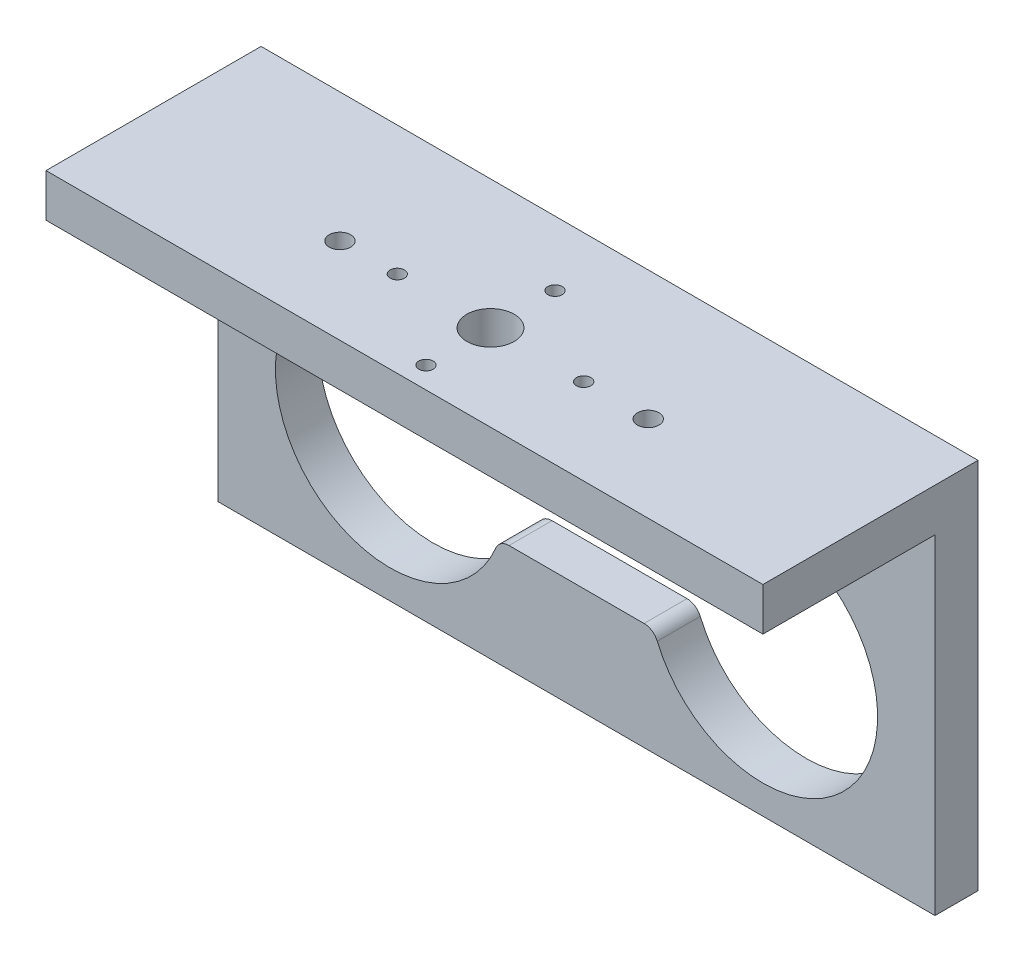
ISO-10303-21;
HEADER;
FILE_DESCRIPTION(('STEP AP214'),'2;1');
FILE_NAME('part.step','',(''),(''),'','','');
FILE_SCHEMA(('AUTOMOTIVE_DESIGN { 1 0 10303 214 1 1 1 1 }'));
ENDSEC;
DATA;
#1=APPLICATION_CONTEXT('core data for automotive mechanical design processes');
#2=APPLICATION_PROTOCOL_DEFINITION('international standard','automotive_design',2000,#1);
#3=PRODUCT_CONTEXT('',#1,'mechanical');
#4=PRODUCT('Part','Part','',(#3));
#5=PRODUCT_RELATED_PRODUCT_CATEGORY('part','',(#4));
#6=PRODUCT_DEFINITION_FORMATION('','',#4);
#7=PRODUCT_DEFINITION_CONTEXT('part definition',#1,'design');
#8=PRODUCT_DEFINITION('design','',#6,#7);
#9=PRODUCT_DEFINITION_SHAPE('','',#8);
#10=(LENGTH_UNIT() NAMED_UNIT(*) SI_UNIT(.MILLI.,.METRE.));
#11=(NAMED_UNIT(*) PLANE_ANGLE_UNIT() SI_UNIT($,.RADIAN.));
#12=(NAMED_UNIT(*) SI_UNIT($,.STERADIAN.) SOLID_ANGLE_UNIT());
#13=UNCERTAINTY_MEASURE_WITH_UNIT(LENGTH_MEASURE(1.E-05),#10,'distance_accuracy_value','');
#14=(GEOMETRIC_REPRESENTATION_CONTEXT(3) GLOBAL_UNCERTAINTY_ASSIGNED_CONTEXT((#13)) GLOBAL_UNIT_ASSIGNED_CONTEXT((#10,
#11,#12)) REPRESENTATION_CONTEXT('',''));
#15=CARTESIAN_POINT('',(0.,0.,0.));
#16=DIRECTION('',(0.,0.,1.));
#17=DIRECTION('',(1.,0.,0.));
#18=AXIS2_PLACEMENT_3D('',#15,#16,#17);
#19=CARTESIAN_POINT('',(-25.,16.,15.));
#20=DIRECTION('',(0.,0.,-1.));
#21=DIRECTION('',(-1.,0.,0.));
#22=AXIS2_PLACEMENT_3D('',#19,#20,#21);
#23=PLANE('',#22);
#24=DIRECTION('',(-1.,0.,0.));
#25=VECTOR('',#24,1.);
#26=CARTESIAN_POINT('',(25.,13.,15.));
#27=LINE('',#26,#25);
#28=CARTESIAN_POINT('',(25.,13.,15.));
#29=VERTEX_POINT('',#28);
#30=CARTESIAN_POINT('',(-25.,13.,15.));
#31=VERTEX_POINT('',#30);
#32=EDGE_CURVE('E167',#29,#31,#27,.T.);
#33=ORIENTED_EDGE('',*,*,#32,.F.);
#34=DIRECTION('',(0.,-1.,0.));
#35=VECTOR('',#34,1.);
#36=CARTESIAN_POINT('',(25.,16.,15.));
#37=LINE('',#36,#35);
#38=CARTESIAN_POINT('',(25.,16.,15.));
#39=VERTEX_POINT('',#38);
#40=EDGE_CURVE('E179',#39,#29,#37,.T.);
#41=ORIENTED_EDGE('',*,*,#40,.F.);
#42=DIRECTION('',(1.,0.,0.));
#43=VECTOR('',#42,1.);
#44=CARTESIAN_POINT('',(-25.,16.,15.));
#45=LINE('',#44,#43);
#46=CARTESIAN_POINT('',(-25.,16.,15.));
#47=VERTEX_POINT('',#46);
#48=EDGE_CURVE('E307',#47,#39,#45,.T.);
#49=ORIENTED_EDGE('',*,*,#48,.F.);
#50=DIRECTION('',(0.,-1.,0.));
#51=VECTOR('',#50,1.);
#52=CARTESIAN_POINT('',(-25.,16.,15.));
#53=LINE('',#52,#51);
#54=EDGE_CURVE('E182',#47,#31,#53,.T.);
#55=ORIENTED_EDGE('',*,*,#54,.T.);
#56=EDGE_LOOP('',(#33,#41,#49,#55));
#57=FACE_BOUND('',#56,.T.);
#58=ADVANCED_FACE('F36',(#57),#23,.F.);
#59=CARTESIAN_POINT('',(0.,0.,3.));
#60=DIRECTION('',(0.,0.,1.));
#61=DIRECTION('',(1.,0.,0.));
#62=AXIS2_PLACEMENT_3D('',#59,#60,#61);
#63=PLANE('',#62);
#64=DIRECTION('',(0.,-1.,0.));
#65=VECTOR('',#64,1.);
#66=CARTESIAN_POINT('',(-25.,-10.,3.));
#67=LINE('',#66,#65);
#68=CARTESIAN_POINT('',(-25.,13.,3.));
#69=VERTEX_POINT('',#68);
#70=CARTESIAN_POINT('',(-25.,-10.,3.));
#71=VERTEX_POINT('',#70);
#72=EDGE_CURVE('E280',#69,#71,#67,.T.);
#73=ORIENTED_EDGE('',*,*,#72,.T.);
#74=DIRECTION('',(1.,0.,0.));
#75=VECTOR('',#74,1.);
#76=CARTESIAN_POINT('',(25.,-10.,3.));
#77=LINE('',#76,#75);
#78=CARTESIAN_POINT('',(25.,-10.,3.));
#79=VERTEX_POINT('',#78);
#80=EDGE_CURVE('E283',#71,#79,#77,.T.);
#81=ORIENTED_EDGE('',*,*,#80,.T.);
#82=DIRECTION('',(0.,1.,0.));
#83=VECTOR('',#82,1.);
#84=CARTESIAN_POINT('',(25.,-10.,3.));
#85=LINE('',#84,#83);
#86=CARTESIAN_POINT('',(25.,13.,3.));
#87=VERTEX_POINT('',#86);
#88=EDGE_CURVE('E286',#79,#87,#85,.T.);
#89=ORIENTED_EDGE('',*,*,#88,.T.);
#90=DIRECTION('',(1.,0.,0.));
#91=VECTOR('',#90,1.);
#92=CARTESIAN_POINT('',(25.,13.,3.));
#93=LINE('',#92,#91);
#94=EDGE_CURVE('E170',#69,#87,#93,.T.);
#95=ORIENTED_EDGE('',*,*,#94,.F.);
#96=EDGE_LOOP('',(#73,#81,#89,#95));
#97=FACE_BOUND('',#96,.T.);
#98=CARTESIAN_POINT('',(13.,0.,3.));
#99=DIRECTION('',(0.,0.,1.));
#100=DIRECTION('',(1.,0.,0.));
#101=AXIS2_PLACEMENT_3D('',#98,#99,#100);
#102=CIRCLE('',#101,8.);
#103=CARTESIAN_POINT('',(5.62972268809911,-3.11111111111111,3.));
#104=VERTEX_POINT('',#103);
#105=CARTESIAN_POINT('',(5.62972268809911,3.11111111111111,3.));
#106=VERTEX_POINT('',#105);
#107=EDGE_CURVE('E223',#104,#106,#102,.T.);
#108=ORIENTED_EDGE('',*,*,#107,.F.);
#109=CARTESIAN_POINT('',(4.7084380241115,-3.5,3.));
#110=DIRECTION('',(0.,0.,-1.));
#111=DIRECTION('',(-1.,0.,0.));
#112=AXIS2_PLACEMENT_3D('',#109,#110,#111);
#113=CIRCLE('',#112,1.);
#114=CARTESIAN_POINT('',(4.7084380241115,-2.5,3.));
#115=VERTEX_POINT('',#114);
#116=EDGE_CURVE('E221',#115,#104,#113,.T.);
#117=ORIENTED_EDGE('',*,*,#116,.F.);
#118=DIRECTION('',(1.,0.,0.));
#119=VECTOR('',#118,1.);
#120=CARTESIAN_POINT('',(4.7084380241115,-2.5,3.));
#121=LINE('',#120,#119);
#122=CARTESIAN_POINT('',(-4.7084380241115,-2.5,3.));
#123=VERTEX_POINT('',#122);
#124=EDGE_CURVE('E237',#123,#115,#121,.T.);
#125=ORIENTED_EDGE('',*,*,#124,.F.);
#126=CARTESIAN_POINT('',(-4.7084380241115,-3.5,3.));
#127=DIRECTION('',(0.,0.,-1.));
#128=DIRECTION('',(1.,0.,0.));
#129=AXIS2_PLACEMENT_3D('',#126,#127,#128);
#130=CIRCLE('',#129,1.);
#131=CARTESIAN_POINT('',(-5.62972268809911,-3.11111111111111,3.));
#132=VERTEX_POINT('',#131);
#133=EDGE_CURVE('E234',#132,#123,#130,.T.);
#134=ORIENTED_EDGE('',*,*,#133,.F.);
#135=CARTESIAN_POINT('',(-13.,0.,3.));
#136=DIRECTION('',(0.,0.,1.));
#137=DIRECTION('',(1.,0.,0.));
#138=AXIS2_PLACEMENT_3D('',#135,#136,#137);
#139=CIRCLE('',#138,8.);
#140=CARTESIAN_POINT('',(-5.62972268809911,3.11111111111111,3.));
#141=VERTEX_POINT('',#140);
#142=EDGE_CURVE('E232',#141,#132,#139,.T.);
#143=ORIENTED_EDGE('',*,*,#142,.F.);
#144=CARTESIAN_POINT('',(-4.7084380241115,3.5,3.));
#145=DIRECTION('',(0.,0.,-1.));
#146=DIRECTION('',(-1.,0.,0.));
#147=AXIS2_PLACEMENT_3D('',#144,#145,#146);
#148=CIRCLE('',#147,1.);
#149=CARTESIAN_POINT('',(-4.7084380241115,2.5,3.));
#150=VERTEX_POINT('',#149);
#151=EDGE_CURVE('E230',#150,#141,#148,.T.);
#152=ORIENTED_EDGE('',*,*,#151,.F.);
#153=DIRECTION('',(-1.,0.,0.));
#154=VECTOR('',#153,1.);
#155=CARTESIAN_POINT('',(-4.7084380241115,2.5,3.));
#156=LINE('',#155,#154);
#157=CARTESIAN_POINT('',(4.7084380241115,2.5,3.));
#158=VERTEX_POINT('',#157);
#159=EDGE_CURVE('E228',#158,#150,#156,.T.);
#160=ORIENTED_EDGE('',*,*,#159,.F.);
#161=CARTESIAN_POINT('',(4.7084380241115,3.5,3.));
#162=DIRECTION('',(0.,0.,-1.));
#163=DIRECTION('',(1.,0.,0.));
#164=AXIS2_PLACEMENT_3D('',#161,#162,#163);
#165=CIRCLE('',#164,1.);
#166=EDGE_CURVE('E226',#106,#158,#165,.T.);
#167=ORIENTED_EDGE('',*,*,#166,.F.);
#168=EDGE_LOOP('',(#108,#117,#125,#134,#143,#152,#160,#167));
#169=FACE_BOUND('',#168,.T.);
#170=DIRECTION('',(-1.,0.,0.));
#171=VECTOR('',#170,1.);
#172=CARTESIAN_POINT('',(3.25,9.,3.));
#173=LINE('',#172,#171);
#174=CARTESIAN_POINT('',(3.25,9.,3.));
#175=VERTEX_POINT('',#174);
#176=CARTESIAN_POINT('',(-3.25,9.,3.));
#177=VERTEX_POINT('',#176);
#178=EDGE_CURVE('E197',#175,#177,#173,.T.);
#179=ORIENTED_EDGE('',*,*,#178,.F.);
#180=CARTESIAN_POINT('',(3.25,7.25,3.));
#181=DIRECTION('',(0.,0.,1.));
#182=DIRECTION('',(1.,0.,0.));
#183=AXIS2_PLACEMENT_3D('',#180,#181,#182);
#184=CIRCLE('',#183,1.75);
#185=CARTESIAN_POINT('',(3.25,5.5,3.));
#186=VERTEX_POINT('',#185);
#187=EDGE_CURVE('E195',#186,#175,#184,.T.);
#188=ORIENTED_EDGE('',*,*,#187,.F.);
#189=DIRECTION('',(1.,0.,0.));
#190=VECTOR('',#189,1.);
#191=CARTESIAN_POINT('',(3.25,5.5,3.));
#192=LINE('',#191,#190);
#193=CARTESIAN_POINT('',(-3.25,5.5,3.));
#194=VERTEX_POINT('',#193);
#195=EDGE_CURVE('E202',#194,#186,#192,.T.);
#196=ORIENTED_EDGE('',*,*,#195,.F.);
#197=CARTESIAN_POINT('',(-3.25,7.25,3.));
#198=DIRECTION('',(0.,0.,1.));
#199=DIRECTION('',(1.,0.,0.));
#200=AXIS2_PLACEMENT_3D('',#197,#198,#199);
#201=CIRCLE('',#200,1.75);
#202=EDGE_CURVE('E200',#177,#194,#201,.T.);
#203=ORIENTED_EDGE('',*,*,#202,.F.);
#204=EDGE_LOOP('',(#179,#188,#196,#203));
#205=FACE_BOUND('',#204,.T.);
#206=ADVANCED_FACE('F381',(#97,#169,#205),#63,.T.);
#207=CARTESIAN_POINT('',(0.,0.,0.));
#208=DIRECTION('',(0.,0.,1.));
#209=DIRECTION('',(1.,0.,0.));
#210=AXIS2_PLACEMENT_3D('',#207,#208,#209);
#211=PLANE('',#210);
#212=CARTESIAN_POINT('',(4.7084380241115,-3.5,0.));
#213=DIRECTION('',(0.,0.,-1.));
#214=DIRECTION('',(-1.,0.,0.));
#215=AXIS2_PLACEMENT_3D('',#212,#213,#214);
#216=CIRCLE('',#215,1.);
#217=CARTESIAN_POINT('',(4.7084380241115,-2.5,0.));
#218=VERTEX_POINT('',#217);
#219=CARTESIAN_POINT('',(5.62972268809911,-3.11111111111111,0.));
#220=VERTEX_POINT('',#219);
#221=EDGE_CURVE('E220',#218,#220,#216,.T.);
#222=ORIENTED_EDGE('',*,*,#221,.T.);
#223=CARTESIAN_POINT('',(13.,0.,0.));
#224=DIRECTION('',(0.,0.,1.));
#225=DIRECTION('',(1.,0.,0.));
#226=AXIS2_PLACEMENT_3D('',#223,#224,#225);
#227=CIRCLE('',#226,8.);
#228=CARTESIAN_POINT('',(5.62972268809911,3.11111111111111,0.));
#229=VERTEX_POINT('',#228);
#230=EDGE_CURVE('E242',#220,#229,#227,.T.);
#231=ORIENTED_EDGE('',*,*,#230,.T.);
#232=CARTESIAN_POINT('',(4.7084380241115,3.5,0.));
#233=DIRECTION('',(0.,0.,-1.));
#234=DIRECTION('',(1.,0.,0.));
#235=AXIS2_PLACEMENT_3D('',#232,#233,#234);
#236=CIRCLE('',#235,1.);
#237=CARTESIAN_POINT('',(4.7084380241115,2.5,0.));
#238=VERTEX_POINT('',#237);
#239=EDGE_CURVE('E245',#229,#238,#236,.T.);
#240=ORIENTED_EDGE('',*,*,#239,.T.);
#241=DIRECTION('',(-1.,0.,0.));
#242=VECTOR('',#241,1.);
#243=CARTESIAN_POINT('',(-4.7084380241115,2.5,0.));
#244=LINE('',#243,#242);
#245=CARTESIAN_POINT('',(-4.7084380241115,2.5,0.));
#246=VERTEX_POINT('',#245);
#247=EDGE_CURVE('E248',#238,#246,#244,.T.);
#248=ORIENTED_EDGE('',*,*,#247,.T.);
#249=CARTESIAN_POINT('',(-4.7084380241115,3.5,0.));
#250=DIRECTION('',(0.,0.,-1.));
#251=DIRECTION('',(-1.,0.,0.));
#252=AXIS2_PLACEMENT_3D('',#249,#250,#251);
#253=CIRCLE('',#252,1.);
#254=CARTESIAN_POINT('',(-5.62972268809911,3.11111111111111,0.));
#255=VERTEX_POINT('',#254);
#256=EDGE_CURVE('E251',#246,#255,#253,.T.);
#257=ORIENTED_EDGE('',*,*,#256,.T.);
#258=CARTESIAN_POINT('',(-13.,0.,0.));
#259=DIRECTION('',(0.,0.,1.));
#260=DIRECTION('',(1.,0.,0.));
#261=AXIS2_PLACEMENT_3D('',#258,#259,#260);
#262=CIRCLE('',#261,8.);
#263=CARTESIAN_POINT('',(-5.62972268809911,-3.11111111111111,0.));
#264=VERTEX_POINT('',#263);
#265=EDGE_CURVE('E254',#255,#264,#262,.T.);
#266=ORIENTED_EDGE('',*,*,#265,.T.);
#267=CARTESIAN_POINT('',(-4.7084380241115,-3.5,0.));
#268=DIRECTION('',(0.,0.,-1.));
#269=DIRECTION('',(1.,0.,0.));
#270=AXIS2_PLACEMENT_3D('',#267,#268,#269);
#271=CIRCLE('',#270,1.);
#272=CARTESIAN_POINT('',(-4.7084380241115,-2.5,0.));
#273=VERTEX_POINT('',#272);
#274=EDGE_CURVE('E257',#264,#273,#271,.T.);
#275=ORIENTED_EDGE('',*,*,#274,.T.);
#276=DIRECTION('',(1.,0.,0.));
#277=VECTOR('',#276,1.);
#278=CARTESIAN_POINT('',(4.7084380241115,-2.5,0.));
#279=LINE('',#278,#277);
#280=EDGE_CURVE('E224',#273,#218,#279,.T.);
#281=ORIENTED_EDGE('',*,*,#280,.T.);
#282=EDGE_LOOP('',(#222,#231,#240,#248,#257,#266,#275,#281));
#283=FACE_BOUND('',#282,.T.);
#284=DIRECTION('',(0.,-1.,0.));
#285=VECTOR('',#284,1.);
#286=CARTESIAN_POINT('',(-25.,-10.,0.));
#287=LINE('',#286,#285);
#288=CARTESIAN_POINT('',(-25.,16.,0.));
#289=VERTEX_POINT('',#288);
#290=CARTESIAN_POINT('',(-25.,-10.,0.));
#291=VERTEX_POINT('',#290);
#292=EDGE_CURVE('E279',#289,#291,#287,.T.);
#293=ORIENTED_EDGE('',*,*,#292,.F.);
#294=DIRECTION('',(-1.,0.,0.));
#295=VECTOR('',#294,1.);
#296=CARTESIAN_POINT('',(-25.,16.,0.));
#297=LINE('',#296,#295);
#298=CARTESIAN_POINT('',(25.,16.,0.));
#299=VERTEX_POINT('',#298);
#300=EDGE_CURVE('E188',#299,#289,#297,.T.);
#301=ORIENTED_EDGE('',*,*,#300,.F.);
#302=DIRECTION('',(0.,1.,0.));
#303=VECTOR('',#302,1.);
#304=CARTESIAN_POINT('',(25.,-10.,0.));
#305=LINE('',#304,#303);
#306=CARTESIAN_POINT('',(25.,-10.,0.));
#307=VERTEX_POINT('',#306);
#308=EDGE_CURVE('E284',#307,#299,#305,.T.);
#309=ORIENTED_EDGE('',*,*,#308,.F.);
#310=DIRECTION('',(1.,0.,0.));
#311=VECTOR('',#310,1.);
#312=CARTESIAN_POINT('',(25.,-10.,0.));
#313=LINE('',#312,#311);
#314=EDGE_CURVE('E290',#291,#307,#313,.T.);
#315=ORIENTED_EDGE('',*,*,#314,.F.);
#316=EDGE_LOOP('',(#293,#301,#309,#315));
#317=FACE_BOUND('',#316,.T.);
#318=CARTESIAN_POINT('',(3.25,7.25,0.));
#319=DIRECTION('',(0.,0.,1.));
#320=DIRECTION('',(1.,0.,0.));
#321=AXIS2_PLACEMENT_3D('',#318,#319,#320);
#322=CIRCLE('',#321,1.75);
#323=CARTESIAN_POINT('',(3.25,5.5,0.));
#324=VERTEX_POINT('',#323);
#325=CARTESIAN_POINT('',(3.25,9.,0.));
#326=VERTEX_POINT('',#325);
#327=EDGE_CURVE('E59',#324,#326,#322,.T.);
#328=ORIENTED_EDGE('',*,*,#327,.T.);
#329=DIRECTION('',(-1.,0.,0.));
#330=VECTOR('',#329,1.);
#331=CARTESIAN_POINT('',(3.25,9.,0.));
#332=LINE('',#331,#330);
#333=CARTESIAN_POINT('',(-3.25,9.,0.));
#334=VERTEX_POINT('',#333);
#335=EDGE_CURVE('E206',#326,#334,#332,.T.);
#336=ORIENTED_EDGE('',*,*,#335,.T.);
#337=CARTESIAN_POINT('',(-3.25,7.25,0.));
#338=DIRECTION('',(0.,0.,1.));
#339=DIRECTION('',(1.,0.,0.));
#340=AXIS2_PLACEMENT_3D('',#337,#338,#339);
#341=CIRCLE('',#340,1.75);
#342=CARTESIAN_POINT('',(-3.25,5.5,0.));
#343=VERTEX_POINT('',#342);
#344=EDGE_CURVE('E209',#334,#343,#341,.T.);
#345=ORIENTED_EDGE('',*,*,#344,.T.);
#346=DIRECTION('',(1.,0.,0.));
#347=VECTOR('',#346,1.);
#348=CARTESIAN_POINT('',(3.25,5.5,0.));
#349=LINE('',#348,#347);
#350=EDGE_CURVE('E198',#343,#324,#349,.T.);
#351=ORIENTED_EDGE('',*,*,#350,.T.);
#352=EDGE_LOOP('',(#328,#336,#345,#351));
#353=FACE_BOUND('',#352,.T.);
#354=ADVANCED_FACE('F298',(#283,#317,#353),#211,.F.);
#355=CARTESIAN_POINT('',(-25.,-10.,3.));
#356=DIRECTION('',(1.,0.,0.));
#357=DIRECTION('',(0.,0.,-1.));
#358=AXIS2_PLACEMENT_3D('',#355,#356,#357);
#359=PLANE('',#358);
#360=ORIENTED_EDGE('',*,*,#72,.F.);
#361=DIRECTION('',(0.,0.,-1.));
#362=VECTOR('',#361,1.);
#363=CARTESIAN_POINT('',(-25.,13.,3.));
#364=LINE('',#363,#362);
#365=EDGE_CURVE('E183',#31,#69,#364,.T.);
#366=ORIENTED_EDGE('',*,*,#365,.F.);
#367=ORIENTED_EDGE('',*,*,#54,.F.);
#368=DIRECTION('',(0.,0.,1.));
#369=VECTOR('',#368,1.);
#370=CARTESIAN_POINT('',(-25.,16.,0.));
#371=LINE('',#370,#369);
#372=EDGE_CURVE('E304',#289,#47,#371,.T.);
#373=ORIENTED_EDGE('',*,*,#372,.F.);
#374=ORIENTED_EDGE('',*,*,#292,.T.);
#375=DIRECTION('',(0.,0.,-1.));
#376=VECTOR('',#375,1.);
#377=CARTESIAN_POINT('',(-25.,-10.,3.));
#378=LINE('',#377,#376);
#379=EDGE_CURVE('E11',#71,#291,#378,.T.);
#380=ORIENTED_EDGE('',*,*,#379,.F.);
#381=EDGE_LOOP('',(#360,#366,#367,#373,#374,#380));
#382=FACE_BOUND('',#381,.T.);
#383=ADVANCED_FACE('F38',(#382),#359,.F.);
#384=CARTESIAN_POINT('',(25.,-10.,3.));
#385=DIRECTION('',(0.,1.,0.));
#386=DIRECTION('',(-1.,0.,0.));
#387=AXIS2_PLACEMENT_3D('',#384,#385,#386);
#388=PLANE('',#387);
#389=ORIENTED_EDGE('',*,*,#314,.T.);
#390=DIRECTION('',(0.,0.,-1.));
#391=VECTOR('',#390,1.);
#392=CARTESIAN_POINT('',(25.,-10.,3.));
#393=LINE('',#392,#391);
#394=EDGE_CURVE('E44',#79,#307,#393,.T.);
#395=ORIENTED_EDGE('',*,*,#394,.F.);
#396=ORIENTED_EDGE('',*,*,#80,.F.);
#397=ORIENTED_EDGE('',*,*,#379,.T.);
#398=EDGE_LOOP('',(#389,#395,#396,#397));
#399=FACE_BOUND('',#398,.T.);
#400=ADVANCED_FACE('F438',(#399),#388,.F.);
#401=CARTESIAN_POINT('',(25.,-10.,3.));
#402=DIRECTION('',(-1.,0.,0.));
#403=DIRECTION('',(0.,0.,1.));
#404=AXIS2_PLACEMENT_3D('',#401,#402,#403);
#405=PLANE('',#404);
#406=DIRECTION('',(0.,0.,1.));
#407=VECTOR('',#406,1.);
#408=CARTESIAN_POINT('',(25.,13.,3.));
#409=LINE('',#408,#407);
#410=EDGE_CURVE('E163',#87,#29,#409,.T.);
#411=ORIENTED_EDGE('',*,*,#410,.F.);
#412=ORIENTED_EDGE('',*,*,#88,.F.);
#413=ORIENTED_EDGE('',*,*,#394,.T.);
#414=ORIENTED_EDGE('',*,*,#308,.T.);
#415=DIRECTION('',(0.,0.,-1.));
#416=VECTOR('',#415,1.);
#417=CARTESIAN_POINT('',(25.,16.,0.));
#418=LINE('',#417,#416);
#419=EDGE_CURVE('E187',#39,#299,#418,.T.);
#420=ORIENTED_EDGE('',*,*,#419,.F.);
#421=ORIENTED_EDGE('',*,*,#40,.T.);
#422=EDGE_LOOP('',(#411,#412,#413,#414,#420,#421));
#423=FACE_BOUND('',#422,.T.);
#424=ADVANCED_FACE('F185',(#423),#405,.F.);
#425=CARTESIAN_POINT('',(4.7084380241115,-3.5,3.));
#426=DIRECTION('',(0.,0.,-1.));
#427=DIRECTION('',(-1.,0.,0.));
#428=AXIS2_PLACEMENT_3D('',#425,#426,#427);
#429=CYLINDRICAL_SURFACE('',#428,1.);
#430=ORIENTED_EDGE('',*,*,#221,.F.);
#431=DIRECTION('',(0.,0.,-1.));
#432=VECTOR('',#431,1.);
#433=CARTESIAN_POINT('',(4.7084380241115,-2.5,3.));
#434=LINE('',#433,#432);
#435=EDGE_CURVE('E239',#115,#218,#434,.T.);
#436=ORIENTED_EDGE('',*,*,#435,.F.);
#437=ORIENTED_EDGE('',*,*,#116,.T.);
#438=DIRECTION('',(0.,0.,-1.));
#439=VECTOR('',#438,1.);
#440=CARTESIAN_POINT('',(5.62972268809911,-3.11111111111111,3.));
#441=LINE('',#440,#439);
#442=EDGE_CURVE('E276',#104,#220,#441,.T.);
#443=ORIENTED_EDGE('',*,*,#442,.T.);
#444=EDGE_LOOP('',(#430,#436,#437,#443));
#445=FACE_BOUND('',#444,.T.);
#446=ADVANCED_FACE('F429',(#445),#429,.T.);
#447=CARTESIAN_POINT('',(13.,0.,3.));
#448=DIRECTION('',(0.,0.,-1.));
#449=DIRECTION('',(-1.,0.,0.));
#450=AXIS2_PLACEMENT_3D('',#447,#448,#449);
#451=CYLINDRICAL_SURFACE('',#450,8.);
#452=ORIENTED_EDGE('',*,*,#230,.F.);
#453=ORIENTED_EDGE('',*,*,#442,.F.);
#454=ORIENTED_EDGE('',*,*,#107,.T.);
#455=DIRECTION('',(0.,0.,-1.));
#456=VECTOR('',#455,1.);
#457=CARTESIAN_POINT('',(5.62972268809911,3.11111111111111,3.));
#458=LINE('',#457,#456);
#459=EDGE_CURVE('E274',#106,#229,#458,.T.);
#460=ORIENTED_EDGE('',*,*,#459,.T.);
#461=EDGE_LOOP('',(#452,#453,#454,#460));
#462=FACE_BOUND('',#461,.T.);
#463=ADVANCED_FACE('F425',(#462),#451,.F.);
#464=CARTESIAN_POINT('',(4.7084380241115,3.5,3.));
#465=DIRECTION('',(0.,0.,-1.));
#466=DIRECTION('',(-1.,0.,0.));
#467=AXIS2_PLACEMENT_3D('',#464,#465,#466);
#468=CYLINDRICAL_SURFACE('',#467,1.);
#469=ORIENTED_EDGE('',*,*,#239,.F.);
#470=ORIENTED_EDGE('',*,*,#459,.F.);
#471=ORIENTED_EDGE('',*,*,#166,.T.);
#472=DIRECTION('',(0.,0.,-1.));
#473=VECTOR('',#472,1.);
#474=CARTESIAN_POINT('',(4.7084380241115,2.5,3.));
#475=LINE('',#474,#473);
#476=EDGE_CURVE('E272',#158,#238,#475,.T.);
#477=ORIENTED_EDGE('',*,*,#476,.T.);
#478=EDGE_LOOP('',(#469,#470,#471,#477));
#479=FACE_BOUND('',#478,.T.);
#480=ADVANCED_FACE('F421',(#479),#468,.T.);
#481=CARTESIAN_POINT('',(-4.7084380241115,2.5,3.));
#482=DIRECTION('',(0.,-1.,0.));
#483=DIRECTION('',(0.,0.,-1.));
#484=AXIS2_PLACEMENT_3D('',#481,#482,#483);
#485=PLANE('',#484);
#486=ORIENTED_EDGE('',*,*,#247,.F.);
#487=ORIENTED_EDGE('',*,*,#476,.F.);
#488=ORIENTED_EDGE('',*,*,#159,.T.);
#489=DIRECTION('',(0.,0.,-1.));
#490=VECTOR('',#489,1.);
#491=CARTESIAN_POINT('',(-4.7084380241115,2.5,3.));
#492=LINE('',#491,#490);
#493=EDGE_CURVE('E270',#150,#246,#492,.T.);
#494=ORIENTED_EDGE('',*,*,#493,.T.);
#495=EDGE_LOOP('',(#486,#487,#488,#494));
#496=FACE_BOUND('',#495,.T.);
#497=ADVANCED_FACE('F417',(#496),#485,.T.);
#498=CARTESIAN_POINT('',(-4.7084380241115,3.5,3.));
#499=DIRECTION('',(0.,0.,-1.));
#500=DIRECTION('',(-1.,0.,0.));
#501=AXIS2_PLACEMENT_3D('',#498,#499,#500);
#502=CYLINDRICAL_SURFACE('',#501,1.);
#503=ORIENTED_EDGE('',*,*,#256,.F.);
#504=ORIENTED_EDGE('',*,*,#493,.F.);
#505=ORIENTED_EDGE('',*,*,#151,.T.);
#506=DIRECTION('',(0.,0.,-1.));
#507=VECTOR('',#506,1.);
#508=CARTESIAN_POINT('',(-5.62972268809911,3.11111111111111,3.));
#509=LINE('',#508,#507);
#510=EDGE_CURVE('E268',#141,#255,#509,.T.);
#511=ORIENTED_EDGE('',*,*,#510,.T.);
#512=EDGE_LOOP('',(#503,#504,#505,#511));
#513=FACE_BOUND('',#512,.T.);
#514=ADVANCED_FACE('F413',(#513),#502,.T.);
#515=CARTESIAN_POINT('',(-13.,0.,3.));
#516=DIRECTION('',(0.,0.,-1.));
#517=DIRECTION('',(-1.,0.,0.));
#518=AXIS2_PLACEMENT_3D('',#515,#516,#517);
#519=CYLINDRICAL_SURFACE('',#518,8.);
#520=ORIENTED_EDGE('',*,*,#265,.F.);
#521=ORIENTED_EDGE('',*,*,#510,.F.);
#522=ORIENTED_EDGE('',*,*,#142,.T.);
#523=DIRECTION('',(0.,0.,-1.));
#524=VECTOR('',#523,1.);
#525=CARTESIAN_POINT('',(-5.62972268809911,-3.11111111111111,3.));
#526=LINE('',#525,#524);
#527=EDGE_CURVE('E266',#132,#264,#526,.T.);
#528=ORIENTED_EDGE('',*,*,#527,.T.);
#529=EDGE_LOOP('',(#520,#521,#522,#528));
#530=FACE_BOUND('',#529,.T.);
#531=ADVANCED_FACE('F409',(#530),#519,.F.);
#532=CARTESIAN_POINT('',(-4.7084380241115,-3.5,3.));
#533=DIRECTION('',(0.,0.,-1.));
#534=DIRECTION('',(-1.,0.,0.));
#535=AXIS2_PLACEMENT_3D('',#532,#533,#534);
#536=CYLINDRICAL_SURFACE('',#535,1.);
#537=ORIENTED_EDGE('',*,*,#274,.F.);
#538=ORIENTED_EDGE('',*,*,#527,.F.);
#539=ORIENTED_EDGE('',*,*,#133,.T.);
#540=DIRECTION('',(0.,0.,-1.));
#541=VECTOR('',#540,1.);
#542=CARTESIAN_POINT('',(-4.7084380241115,-2.5,3.));
#543=LINE('',#542,#541);
#544=EDGE_CURVE('E264',#123,#273,#543,.T.);
#545=ORIENTED_EDGE('',*,*,#544,.T.);
#546=EDGE_LOOP('',(#537,#538,#539,#545));
#547=FACE_BOUND('',#546,.T.);
#548=ADVANCED_FACE('F405',(#547),#536,.T.);
#549=CARTESIAN_POINT('',(4.7084380241115,-2.5,3.));
#550=DIRECTION('',(0.,1.,0.));
#551=DIRECTION('',(-1.,0.,0.));
#552=AXIS2_PLACEMENT_3D('',#549,#550,#551);
#553=PLANE('',#552);
#554=ORIENTED_EDGE('',*,*,#280,.F.);
#555=ORIENTED_EDGE('',*,*,#544,.F.);
#556=ORIENTED_EDGE('',*,*,#124,.T.);
#557=ORIENTED_EDGE('',*,*,#435,.T.);
#558=EDGE_LOOP('',(#554,#555,#556,#557));
#559=FACE_BOUND('',#558,.T.);
#560=ADVANCED_FACE('F402',(#559),#553,.T.);
#561=CARTESIAN_POINT('',(3.25,7.25,3.));
#562=DIRECTION('',(0.,0.,-1.));
#563=DIRECTION('',(-1.,0.,0.));
#564=AXIS2_PLACEMENT_3D('',#561,#562,#563);
#565=CYLINDRICAL_SURFACE('',#564,1.75);
#566=ORIENTED_EDGE('',*,*,#327,.F.);
#567=DIRECTION('',(0.,0.,-1.));
#568=VECTOR('',#567,1.);
#569=CARTESIAN_POINT('',(3.25,5.5,3.));
#570=LINE('',#569,#568);
#571=EDGE_CURVE('E204',#186,#324,#570,.T.);
#572=ORIENTED_EDGE('',*,*,#571,.F.);
#573=ORIENTED_EDGE('',*,*,#187,.T.);
#574=DIRECTION('',(0.,0.,-1.));
#575=VECTOR('',#574,1.);
#576=CARTESIAN_POINT('',(3.25,9.,3.));
#577=LINE('',#576,#575);
#578=EDGE_CURVE('E218',#175,#326,#577,.T.);
#579=ORIENTED_EDGE('',*,*,#578,.T.);
#580=EDGE_LOOP('',(#566,#572,#573,#579));
#581=FACE_BOUND('',#580,.T.);
#582=ADVANCED_FACE('F398',(#581),#565,.F.);
#583=CARTESIAN_POINT('',(3.25,9.,3.));
#584=DIRECTION('',(0.,-1.,0.));
#585=DIRECTION('',(1.,0.,0.));
#586=AXIS2_PLACEMENT_3D('',#583,#584,#585);
#587=PLANE('',#586);
#588=ORIENTED_EDGE('',*,*,#335,.F.);
#589=ORIENTED_EDGE('',*,*,#578,.F.);
#590=ORIENTED_EDGE('',*,*,#178,.T.);
#591=DIRECTION('',(0.,0.,-1.));
#592=VECTOR('',#591,1.);
#593=CARTESIAN_POINT('',(-3.25,9.,3.));
#594=LINE('',#593,#592);
#595=EDGE_CURVE('E216',#177,#334,#594,.T.);
#596=ORIENTED_EDGE('',*,*,#595,.T.);
#597=EDGE_LOOP('',(#588,#589,#590,#596));
#598=FACE_BOUND('',#597,.T.);
#599=ADVANCED_FACE('F394',(#598),#587,.T.);
#600=CARTESIAN_POINT('',(-3.25,7.25,3.));
#601=DIRECTION('',(0.,0.,-1.));
#602=DIRECTION('',(-1.,0.,0.));
#603=AXIS2_PLACEMENT_3D('',#600,#601,#602);
#604=CYLINDRICAL_SURFACE('',#603,1.75);
#605=ORIENTED_EDGE('',*,*,#344,.F.);
#606=ORIENTED_EDGE('',*,*,#595,.F.);
#607=ORIENTED_EDGE('',*,*,#202,.T.);
#608=DIRECTION('',(0.,0.,-1.));
#609=VECTOR('',#608,1.);
#610=CARTESIAN_POINT('',(-3.25,5.5,3.));
#611=LINE('',#610,#609);
#612=EDGE_CURVE('E51',#194,#343,#611,.T.);
#613=ORIENTED_EDGE('',*,*,#612,.T.);
#614=EDGE_LOOP('',(#605,#606,#607,#613));
#615=FACE_BOUND('',#614,.T.);
#616=ADVANCED_FACE('F391',(#615),#604,.F.);
#617=CARTESIAN_POINT('',(3.25,5.5,3.));
#618=DIRECTION('',(0.,1.,0.));
#619=DIRECTION('',(0.,0.,1.));
#620=AXIS2_PLACEMENT_3D('',#617,#618,#619);
#621=PLANE('',#620);
#622=ORIENTED_EDGE('',*,*,#350,.F.);
#623=ORIENTED_EDGE('',*,*,#612,.F.);
#624=ORIENTED_EDGE('',*,*,#195,.T.);
#625=ORIENTED_EDGE('',*,*,#571,.T.);
#626=EDGE_LOOP('',(#622,#623,#624,#625));
#627=FACE_BOUND('',#626,.T.);
#628=ADVANCED_FACE('F360',(#627),#621,.T.);
#629=CARTESIAN_POINT('',(0.,16.,0.));
#630=DIRECTION('',(0.,1.,0.));
#631=DIRECTION('',(-1.,0.,0.));
#632=AXIS2_PLACEMENT_3D('',#629,#630,#631);
#633=PLANE('',#632);
#634=CARTESIAN_POINT('',(-10.5,16.,9.));
#635=DIRECTION('',(0.,1.,0.));
#636=DIRECTION('',(-1.,0.,0.));
#637=AXIS2_PLACEMENT_3D('',#634,#635,#636);
#638=CIRCLE('',#637,0.75);
#639=CARTESIAN_POINT('',(-11.25,16.,9.));
#640=VERTEX_POINT('',#639);
#641=EDGE_CURVE('E335',#640,#640,#638,.T.);
#642=ORIENTED_EDGE('',*,*,#641,.F.);
#643=EDGE_LOOP('',(#642));
#644=FACE_BOUND('',#643,.T.);
#645=CARTESIAN_POINT('',(11.,16.,9.));
#646=DIRECTION('',(0.,1.,0.));
#647=DIRECTION('',(-1.,0.,0.));
#648=AXIS2_PLACEMENT_3D('',#645,#646,#647);
#649=CIRCLE('',#648,0.75);
#650=CARTESIAN_POINT('',(10.25,16.,9.));
#651=VERTEX_POINT('',#650);
#652=EDGE_CURVE('E334',#651,#651,#649,.T.);
#653=ORIENTED_EDGE('',*,*,#652,.F.);
#654=EDGE_LOOP('',(#653));
#655=FACE_BOUND('',#654,.T.);
#656=CARTESIAN_POINT('',(-6.5,16.,9.));
#657=DIRECTION('',(0.,1.,0.));
#658=DIRECTION('',(-1.,0.,0.));
#659=AXIS2_PLACEMENT_3D('',#656,#657,#658);
#660=CIRCLE('',#659,0.500000000000002);
#661=CARTESIAN_POINT('',(-7.,16.,9.));
#662=VERTEX_POINT('',#661);
#663=EDGE_CURVE('E323',#662,#662,#660,.T.);
#664=ORIENTED_EDGE('',*,*,#663,.F.);
#665=EDGE_LOOP('',(#664));
#666=FACE_BOUND('',#665,.T.);
#667=CARTESIAN_POINT('',(6.5,16.,9.));
#668=DIRECTION('',(0.,1.,0.));
#669=DIRECTION('',(-1.,0.,0.));
#670=AXIS2_PLACEMENT_3D('',#667,#668,#669);
#671=CIRCLE('',#670,0.500000000000002);
#672=CARTESIAN_POINT('',(6.,16.,9.));
#673=VERTEX_POINT('',#672);
#674=EDGE_CURVE('E322',#673,#673,#671,.T.);
#675=ORIENTED_EDGE('',*,*,#674,.F.);
#676=EDGE_LOOP('',(#675));
#677=FACE_BOUND('',#676,.T.);
#678=CARTESIAN_POINT('',(0.,16.,4.5));
#679=DIRECTION('',(0.,1.,0.));
#680=DIRECTION('',(-1.,0.,0.));
#681=AXIS2_PLACEMENT_3D('',#678,#679,#680);
#682=CIRCLE('',#681,0.5);
#683=CARTESIAN_POINT('',(-0.500000000000003,16.,4.5));
#684=VERTEX_POINT('',#683);
#685=EDGE_CURVE('E346',#684,#684,#682,.T.);
#686=ORIENTED_EDGE('',*,*,#685,.F.);
#687=EDGE_LOOP('',(#686));
#688=FACE_BOUND('',#687,.T.);
#689=CARTESIAN_POINT('',(0.,16.,13.5));
#690=DIRECTION('',(0.,1.,0.));
#691=DIRECTION('',(-1.,0.,0.));
#692=AXIS2_PLACEMENT_3D('',#689,#690,#691);
#693=CIRCLE('',#692,0.5);
#694=CARTESIAN_POINT('',(-0.500000000000003,16.,13.5));
#695=VERTEX_POINT('',#694);
#696=EDGE_CURVE('E347',#695,#695,#693,.T.);
#697=ORIENTED_EDGE('',*,*,#696,.F.);
#698=EDGE_LOOP('',(#697));
#699=FACE_BOUND('',#698,.T.);
#700=CARTESIAN_POINT('',(0.,16.,9.));
#701=DIRECTION('',(0.,1.,0.));
#702=DIRECTION('',(-1.,0.,0.));
#703=AXIS2_PLACEMENT_3D('',#700,#701,#702);
#704=CIRCLE('',#703,1.65);
#705=CARTESIAN_POINT('',(-1.65,16.,9.));
#706=VERTEX_POINT('',#705);
#707=EDGE_CURVE('E315',#706,#706,#704,.T.);
#708=ORIENTED_EDGE('',*,*,#707,.F.);
#709=EDGE_LOOP('',(#708));
#710=FACE_BOUND('',#709,.T.);
#711=ORIENTED_EDGE('',*,*,#372,.T.);
#712=ORIENTED_EDGE('',*,*,#48,.T.);
#713=ORIENTED_EDGE('',*,*,#419,.T.);
#714=ORIENTED_EDGE('',*,*,#300,.T.);
#715=EDGE_LOOP('',(#711,#712,#713,#714));
#716=FACE_BOUND('',#715,.T.);
#717=ADVANCED_FACE('F303',(#644,#655,#666,#677,#688,#699,#710,#716),#633,.T.);
#718=CARTESIAN_POINT('',(0.,13.,0.));
#719=DIRECTION('',(0.,-1.,0.));
#720=DIRECTION('',(1.,0.,0.));
#721=AXIS2_PLACEMENT_3D('',#718,#719,#720);
#722=PLANE('',#721);
#723=CARTESIAN_POINT('',(-10.5,13.,9.));
#724=DIRECTION('',(0.,-1.,0.));
#725=DIRECTION('',(1.,0.,0.));
#726=AXIS2_PLACEMENT_3D('',#723,#724,#725);
#727=CIRCLE('',#726,0.75);
#728=CARTESIAN_POINT('',(-9.75,13.,9.));
#729=VERTEX_POINT('',#728);
#730=EDGE_CURVE('E331',#729,#729,#727,.F.);
#731=ORIENTED_EDGE('',*,*,#730,.T.);
#732=EDGE_LOOP('',(#731));
#733=FACE_BOUND('',#732,.T.);
#734=CARTESIAN_POINT('',(11.,13.,9.));
#735=DIRECTION('',(0.,-1.,0.));
#736=DIRECTION('',(1.,0.,0.));
#737=AXIS2_PLACEMENT_3D('',#734,#735,#736);
#738=CIRCLE('',#737,0.75);
#739=CARTESIAN_POINT('',(11.75,13.,9.));
#740=VERTEX_POINT('',#739);
#741=EDGE_CURVE('E326',#740,#740,#738,.F.);
#742=ORIENTED_EDGE('',*,*,#741,.T.);
#743=EDGE_LOOP('',(#742));
#744=FACE_BOUND('',#743,.T.);
#745=CARTESIAN_POINT('',(-6.5,13.,9.));
#746=DIRECTION('',(0.,-1.,0.));
#747=DIRECTION('',(1.,0.,0.));
#748=AXIS2_PLACEMENT_3D('',#745,#746,#747);
#749=CIRCLE('',#748,0.500000000000002);
#750=CARTESIAN_POINT('',(-6.,13.,9.));
#751=VERTEX_POINT('',#750);
#752=EDGE_CURVE('E319',#751,#751,#749,.F.);
#753=ORIENTED_EDGE('',*,*,#752,.T.);
#754=EDGE_LOOP('',(#753));
#755=FACE_BOUND('',#754,.T.);
#756=CARTESIAN_POINT('',(6.5,13.,9.));
#757=DIRECTION('',(0.,-1.,0.));
#758=DIRECTION('',(1.,0.,0.));
#759=AXIS2_PLACEMENT_3D('',#756,#757,#758);
#760=CIRCLE('',#759,0.500000000000002);
#761=CARTESIAN_POINT('',(7.,13.,9.));
#762=VERTEX_POINT('',#761);
#763=EDGE_CURVE('E318',#762,#762,#760,.F.);
#764=ORIENTED_EDGE('',*,*,#763,.T.);
#765=EDGE_LOOP('',(#764));
#766=FACE_BOUND('',#765,.T.);
#767=CARTESIAN_POINT('',(0.,13.,4.5));
#768=DIRECTION('',(0.,-1.,0.));
#769=DIRECTION('',(1.,0.,0.));
#770=AXIS2_PLACEMENT_3D('',#767,#768,#769);
#771=CIRCLE('',#770,0.5);
#772=CARTESIAN_POINT('',(0.499999999999999,13.,4.5));
#773=VERTEX_POINT('',#772);
#774=EDGE_CURVE('E338',#773,#773,#771,.F.);
#775=ORIENTED_EDGE('',*,*,#774,.T.);
#776=EDGE_LOOP('',(#775));
#777=FACE_BOUND('',#776,.T.);
#778=CARTESIAN_POINT('',(0.,13.,13.5));
#779=DIRECTION('',(0.,-1.,0.));
#780=DIRECTION('',(1.,0.,0.));
#781=AXIS2_PLACEMENT_3D('',#778,#779,#780);
#782=CIRCLE('',#781,0.5);
#783=CARTESIAN_POINT('',(0.499999999999999,13.,13.5));
#784=VERTEX_POINT('',#783);
#785=EDGE_CURVE('E343',#784,#784,#782,.F.);
#786=ORIENTED_EDGE('',*,*,#785,.T.);
#787=EDGE_LOOP('',(#786));
#788=FACE_BOUND('',#787,.T.);
#789=CARTESIAN_POINT('',(0.,13.,9.));
#790=DIRECTION('',(0.,-1.,0.));
#791=DIRECTION('',(1.,0.,0.));
#792=AXIS2_PLACEMENT_3D('',#789,#790,#791);
#793=CIRCLE('',#792,1.65);
#794=CARTESIAN_POINT('',(1.65,13.,9.));
#795=VERTEX_POINT('',#794);
#796=EDGE_CURVE('E174',#795,#795,#793,.F.);
#797=ORIENTED_EDGE('',*,*,#796,.T.);
#798=EDGE_LOOP('',(#797));
#799=FACE_BOUND('',#798,.T.);
#800=ORIENTED_EDGE('',*,*,#410,.T.);
#801=ORIENTED_EDGE('',*,*,#32,.T.);
#802=ORIENTED_EDGE('',*,*,#365,.T.);
#803=ORIENTED_EDGE('',*,*,#94,.T.);
#804=EDGE_LOOP('',(#800,#801,#802,#803));
#805=FACE_BOUND('',#804,.T.);
#806=ADVANCED_FACE('F165',(#733,#744,#755,#766,#777,#788,#799,#805),#722,.T.);
#807=CARTESIAN_POINT('',(0.,8.33309524416878,9.));
#808=DIRECTION('',(0.,1.,0.));
#809=DIRECTION('',(-1.,0.,0.));
#810=AXIS2_PLACEMENT_3D('',#807,#808,#809);
#811=CYLINDRICAL_SURFACE('',#810,1.65);
#812=ORIENTED_EDGE('',*,*,#707,.T.);
#813=EDGE_LOOP('',(#812));
#814=FACE_BOUND('',#813,.T.);
#815=ORIENTED_EDGE('',*,*,#796,.F.);
#816=EDGE_LOOP('',(#815));
#817=FACE_BOUND('',#816,.T.);
#818=ADVANCED_FACE('F367',(#814,#817),#811,.F.);
#819=CARTESIAN_POINT('',(0.,8.33309524416878,13.5));
#820=DIRECTION('',(0.,1.,0.));
#821=DIRECTION('',(-1.,0.,0.));
#822=AXIS2_PLACEMENT_3D('',#819,#820,#821);
#823=CYLINDRICAL_SURFACE('',#822,0.5);
#824=ORIENTED_EDGE('',*,*,#696,.T.);
#825=EDGE_LOOP('',(#824));
#826=FACE_BOUND('',#825,.T.);
#827=ORIENTED_EDGE('',*,*,#785,.F.);
#828=EDGE_LOOP('',(#827));
#829=FACE_BOUND('',#828,.T.);
#830=ADVANCED_FACE('F370',(#826,#829),#823,.F.);
#831=CARTESIAN_POINT('',(0.,8.33309524416878,4.5));
#832=DIRECTION('',(0.,1.,0.));
#833=DIRECTION('',(-1.,0.,0.));
#834=AXIS2_PLACEMENT_3D('',#831,#832,#833);
#835=CYLINDRICAL_SURFACE('',#834,0.5);
#836=ORIENTED_EDGE('',*,*,#685,.T.);
#837=EDGE_LOOP('',(#836));
#838=FACE_BOUND('',#837,.T.);
#839=ORIENTED_EDGE('',*,*,#774,.F.);
#840=EDGE_LOOP('',(#839));
#841=FACE_BOUND('',#840,.T.);
#842=ADVANCED_FACE('F355',(#838,#841),#835,.F.);
#843=CARTESIAN_POINT('',(6.5,8.33309524416878,9.));
#844=DIRECTION('',(0.,1.,0.));
#845=DIRECTION('',(-1.,0.,0.));
#846=AXIS2_PLACEMENT_3D('',#843,#844,#845);
#847=CYLINDRICAL_SURFACE('',#846,0.500000000000002);
#848=ORIENTED_EDGE('',*,*,#674,.T.);
#849=EDGE_LOOP('',(#848));
#850=FACE_BOUND('',#849,.T.);
#851=ORIENTED_EDGE('',*,*,#763,.F.);
#852=EDGE_LOOP('',(#851));
#853=FACE_BOUND('',#852,.T.);
#854=ADVANCED_FACE('F619',(#850,#853),#847,.F.);
#855=CARTESIAN_POINT('',(-6.5,8.33309524416878,9.));
#856=DIRECTION('',(0.,1.,0.));
#857=DIRECTION('',(-1.,0.,0.));
#858=AXIS2_PLACEMENT_3D('',#855,#856,#857);
#859=CYLINDRICAL_SURFACE('',#858,0.500000000000002);
#860=ORIENTED_EDGE('',*,*,#663,.T.);
#861=EDGE_LOOP('',(#860));
#862=FACE_BOUND('',#861,.T.);
#863=ORIENTED_EDGE('',*,*,#752,.F.);
#864=EDGE_LOOP('',(#863));
#865=FACE_BOUND('',#864,.T.);
#866=ADVANCED_FACE('F628',(#862,#865),#859,.F.);
#867=CARTESIAN_POINT('',(11.,8.33309524416878,9.));
#868=DIRECTION('',(0.,1.,0.));
#869=DIRECTION('',(-1.,0.,0.));
#870=AXIS2_PLACEMENT_3D('',#867,#868,#869);
#871=CYLINDRICAL_SURFACE('',#870,0.75);
#872=ORIENTED_EDGE('',*,*,#652,.T.);
#873=EDGE_LOOP('',(#872));
#874=FACE_BOUND('',#873,.T.);
#875=ORIENTED_EDGE('',*,*,#741,.F.);
#876=EDGE_LOOP('',(#875));
#877=FACE_BOUND('',#876,.T.);
#878=ADVANCED_FACE('F638',(#874,#877),#871,.F.);
#879=CARTESIAN_POINT('',(-10.5,8.33309524416878,9.));
#880=DIRECTION('',(0.,1.,0.));
#881=DIRECTION('',(-1.,0.,0.));
#882=AXIS2_PLACEMENT_3D('',#879,#880,#881);
#883=CYLINDRICAL_SURFACE('',#882,0.75);
#884=ORIENTED_EDGE('',*,*,#641,.T.);
#885=EDGE_LOOP('',(#884));
#886=FACE_BOUND('',#885,.T.);
#887=ORIENTED_EDGE('',*,*,#730,.F.);
#888=EDGE_LOOP('',(#887));
#889=FACE_BOUND('',#888,.T.);
#890=ADVANCED_FACE('F648',(#886,#889),#883,.F.);
#891=CLOSED_SHELL('',(#58,#206,#354,#383,#400,#424,#446,#463,#480,#497,#514,#531,#548,#560,#582,
#599,#616,#628,#717,#806,#818,#830,#842,#854,#866,#878,#890));
#892=MANIFOLD_SOLID_BREP('B2',#891);
#893=ADVANCED_BREP_SHAPE_REPRESENTATION('',(#18,#892),#14);
#894=SHAPE_DEFINITION_REPRESENTATION(#9,#893);
ENDSEC;
END-ISO-10303-21;
